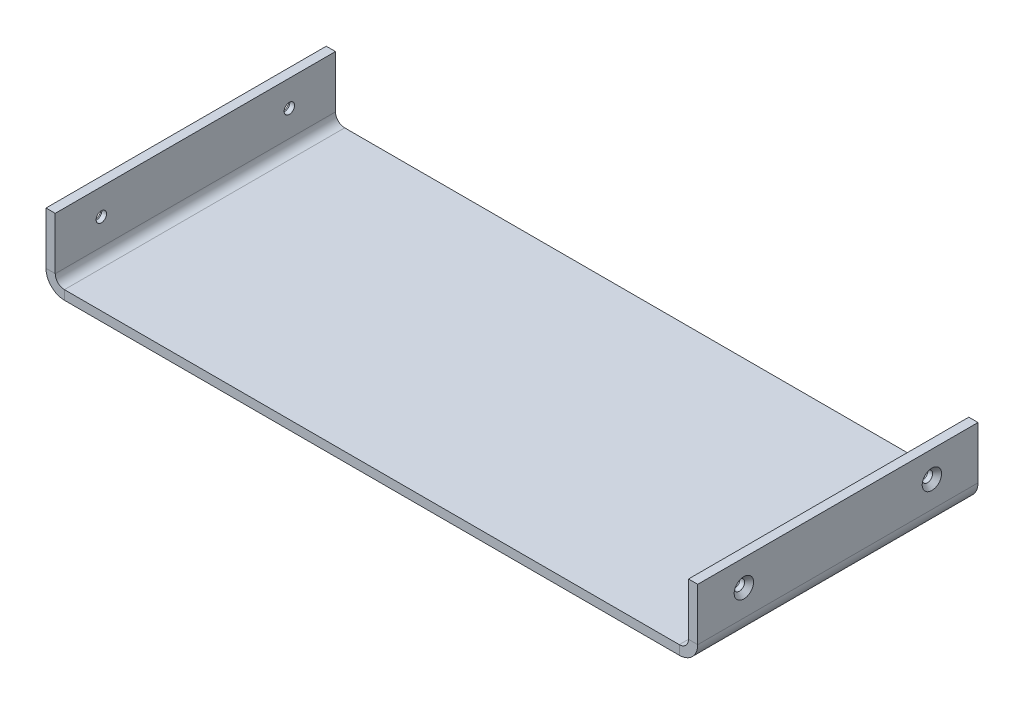
ISO-10303-21;
HEADER;
FILE_DESCRIPTION(('STEP AP214'),'2;1');
FILE_NAME('part.step','',(''),(''),'','','');
FILE_SCHEMA(('AUTOMOTIVE_DESIGN { 1 0 10303 214 1 1 1 1 }'));
ENDSEC;
DATA;
#1=APPLICATION_CONTEXT('core data for automotive mechanical design processes');
#2=APPLICATION_PROTOCOL_DEFINITION('international standard','automotive_design',2000,#1);
#3=PRODUCT_CONTEXT('',#1,'mechanical');
#4=PRODUCT('Part','Part','',(#3));
#5=PRODUCT_RELATED_PRODUCT_CATEGORY('part','',(#4));
#6=PRODUCT_DEFINITION_FORMATION('','',#4);
#7=PRODUCT_DEFINITION_CONTEXT('part definition',#1,'design');
#8=PRODUCT_DEFINITION('design','',#6,#7);
#9=PRODUCT_DEFINITION_SHAPE('','',#8);
#10=(LENGTH_UNIT() NAMED_UNIT(*) SI_UNIT(.MILLI.,.METRE.));
#11=(NAMED_UNIT(*) PLANE_ANGLE_UNIT() SI_UNIT($,.RADIAN.));
#12=(NAMED_UNIT(*) SI_UNIT($,.STERADIAN.) SOLID_ANGLE_UNIT());
#13=UNCERTAINTY_MEASURE_WITH_UNIT(LENGTH_MEASURE(1.E-05),#10,'distance_accuracy_value','');
#14=(GEOMETRIC_REPRESENTATION_CONTEXT(3) GLOBAL_UNCERTAINTY_ASSIGNED_CONTEXT((#13)) GLOBAL_UNIT_ASSIGNED_CONTEXT((#10,
#11,#12)) REPRESENTATION_CONTEXT('',''));
#15=CARTESIAN_POINT('',(0.,0.,0.));
#16=DIRECTION('',(0.,0.,1.));
#17=DIRECTION('',(1.,0.,0.));
#18=AXIS2_PLACEMENT_3D('',#15,#16,#17);
#19=CARTESIAN_POINT('',(100.,-3.,-45.58));
#20=DIRECTION('',(0.,0.,-1.));
#21=DIRECTION('',(-1.,0.,0.));
#22=AXIS2_PLACEMENT_3D('',#19,#20,#21);
#23=PLANE('',#22);
#24=DIRECTION('',(-1.,0.,0.));
#25=VECTOR('',#24,1.);
#26=CARTESIAN_POINT('',(100.,0.,-45.58));
#27=LINE('',#26,#25);
#28=CARTESIAN_POINT('',(100.,0.,-45.58));
#29=VERTEX_POINT('',#28);
#30=CARTESIAN_POINT('',(-100.,0.,-45.58));
#31=VERTEX_POINT('',#30);
#32=EDGE_CURVE('E118',#29,#31,#27,.T.);
#33=ORIENTED_EDGE('',*,*,#32,.F.);
#34=DIRECTION('',(0.,1.,0.));
#35=VECTOR('',#34,1.);
#36=CARTESIAN_POINT('',(100.,-3.,-45.58));
#37=LINE('',#36,#35);
#38=CARTESIAN_POINT('',(100.,-3.,-45.58));
#39=VERTEX_POINT('',#38);
#40=EDGE_CURVE('E86',#39,#29,#37,.T.);
#41=ORIENTED_EDGE('',*,*,#40,.F.);
#42=DIRECTION('',(-1.,0.,0.));
#43=VECTOR('',#42,1.);
#44=CARTESIAN_POINT('',(100.,-3.,-45.58));
#45=LINE('',#44,#43);
#46=CARTESIAN_POINT('',(-100.,-3.,-45.58));
#47=VERTEX_POINT('',#46);
#48=EDGE_CURVE('E120',#39,#47,#45,.T.);
#49=ORIENTED_EDGE('',*,*,#48,.T.);
#50=DIRECTION('',(0.,1.,0.));
#51=VECTOR('',#50,1.);
#52=CARTESIAN_POINT('',(-100.,-3.,-45.58));
#53=LINE('',#52,#51);
#54=EDGE_CURVE('E13',#47,#31,#53,.T.);
#55=ORIENTED_EDGE('',*,*,#54,.T.);
#56=EDGE_LOOP('',(#33,#41,#49,#55));
#57=FACE_BOUND('',#56,.T.);
#58=ADVANCED_FACE('F76',(#57),#23,.T.);
#59=CARTESIAN_POINT('',(100.,-3.,45.58));
#60=DIRECTION('',(0.,0.,1.));
#61=DIRECTION('',(1.,0.,0.));
#62=AXIS2_PLACEMENT_3D('',#59,#60,#61);
#63=PLANE('',#62);
#64=DIRECTION('',(1.,0.,0.));
#65=VECTOR('',#64,1.);
#66=CARTESIAN_POINT('',(100.,0.,45.58));
#67=LINE('',#66,#65);
#68=CARTESIAN_POINT('',(-100.,0.,45.58));
#69=VERTEX_POINT('',#68);
#70=CARTESIAN_POINT('',(100.,0.,45.58));
#71=VERTEX_POINT('',#70);
#72=EDGE_CURVE('E141',#69,#71,#67,.T.);
#73=ORIENTED_EDGE('',*,*,#72,.F.);
#74=DIRECTION('',(0.,1.,0.));
#75=VECTOR('',#74,1.);
#76=CARTESIAN_POINT('',(-100.,-3.,45.58));
#77=LINE('',#76,#75);
#78=CARTESIAN_POINT('',(-100.,-3.,45.58));
#79=VERTEX_POINT('',#78);
#80=EDGE_CURVE('E163',#79,#69,#77,.T.);
#81=ORIENTED_EDGE('',*,*,#80,.F.);
#82=DIRECTION('',(1.,0.,0.));
#83=VECTOR('',#82,1.);
#84=CARTESIAN_POINT('',(100.,-3.,45.58));
#85=LINE('',#84,#83);
#86=CARTESIAN_POINT('',(100.,-3.,45.58));
#87=VERTEX_POINT('',#86);
#88=EDGE_CURVE('E157',#79,#87,#85,.T.);
#89=ORIENTED_EDGE('',*,*,#88,.T.);
#90=DIRECTION('',(0.,1.,0.));
#91=VECTOR('',#90,1.);
#92=CARTESIAN_POINT('',(100.,-3.,45.58));
#93=LINE('',#92,#91);
#94=EDGE_CURVE('E168',#87,#71,#93,.T.);
#95=ORIENTED_EDGE('',*,*,#94,.T.);
#96=EDGE_LOOP('',(#73,#81,#89,#95));
#97=FACE_BOUND('',#96,.T.);
#98=ADVANCED_FACE('F78',(#97),#63,.T.);
#99=CARTESIAN_POINT('',(0.,-3.,0.));
#100=DIRECTION('',(0.,1.,0.));
#101=DIRECTION('',(0.,0.,1.));
#102=AXIS2_PLACEMENT_3D('',#99,#100,#101);
#103=PLANE('',#102);
#104=DIRECTION('',(0.,0.,1.));
#105=VECTOR('',#104,1.);
#106=CARTESIAN_POINT('',(-100.,-3.,45.58));
#107=LINE('',#106,#105);
#108=EDGE_CURVE('E95',#47,#79,#107,.T.);
#109=ORIENTED_EDGE('',*,*,#108,.F.);
#110=ORIENTED_EDGE('',*,*,#48,.F.);
#111=DIRECTION('',(0.,0.,-1.));
#112=VECTOR('',#111,1.);
#113=CARTESIAN_POINT('',(100.,-3.,45.58));
#114=LINE('',#113,#112);
#115=EDGE_CURVE('E160',#87,#39,#114,.T.);
#116=ORIENTED_EDGE('',*,*,#115,.F.);
#117=ORIENTED_EDGE('',*,*,#88,.F.);
#118=EDGE_LOOP('',(#109,#110,#116,#117));
#119=FACE_BOUND('',#118,.T.);
#120=ADVANCED_FACE('F323',(#119),#103,.F.);
#121=CARTESIAN_POINT('',(0.,0.,0.));
#122=DIRECTION('',(0.,1.,0.));
#123=DIRECTION('',(0.,0.,1.));
#124=AXIS2_PLACEMENT_3D('',#121,#122,#123);
#125=PLANE('',#124);
#126=DIRECTION('',(0.,0.,1.));
#127=VECTOR('',#126,1.);
#128=CARTESIAN_POINT('',(-100.,0.,45.58));
#129=LINE('',#128,#127);
#130=EDGE_CURVE('E128',#31,#69,#129,.T.);
#131=ORIENTED_EDGE('',*,*,#130,.T.);
#132=ORIENTED_EDGE('',*,*,#72,.T.);
#133=DIRECTION('',(0.,0.,-1.));
#134=VECTOR('',#133,1.);
#135=CARTESIAN_POINT('',(100.,0.,45.58));
#136=LINE('',#135,#134);
#137=EDGE_CURVE('E113',#71,#29,#136,.T.);
#138=ORIENTED_EDGE('',*,*,#137,.T.);
#139=ORIENTED_EDGE('',*,*,#32,.T.);
#140=EDGE_LOOP('',(#131,#132,#138,#139));
#141=FACE_BOUND('',#140,.T.);
#142=ADVANCED_FACE('F127',(#141),#125,.T.);
#143=CARTESIAN_POINT('',(-100.,3.,-45.58));
#144=DIRECTION('',(0.,0.,-1.));
#145=DIRECTION('',(-1.,0.,0.));
#146=AXIS2_PLACEMENT_3D('',#143,#144,#145);
#147=PLANE('',#146);
#148=DIRECTION('',(1.,0.,0.));
#149=VECTOR('',#148,1.);
#150=CARTESIAN_POINT('',(-106.,2.99999999999998,-45.58));
#151=LINE('',#150,#149);
#152=CARTESIAN_POINT('',(-103.,2.99999999999999,-45.58));
#153=VERTEX_POINT('',#152);
#154=CARTESIAN_POINT('',(-106.,2.99999999999998,-45.58));
#155=VERTEX_POINT('',#154);
#156=EDGE_CURVE('E147',#153,#155,#151,.F.);
#157=ORIENTED_EDGE('',*,*,#156,.F.);
#158=CARTESIAN_POINT('',(-100.,3.,-45.58));
#159=DIRECTION('',(0.,0.,1.));
#160=DIRECTION('',(1.,0.,0.));
#161=AXIS2_PLACEMENT_3D('',#158,#159,#160);
#162=CIRCLE('',#161,3.);
#163=EDGE_CURVE('E137',#31,#153,#162,.F.);
#164=ORIENTED_EDGE('',*,*,#163,.F.);
#165=ORIENTED_EDGE('',*,*,#54,.F.);
#166=CARTESIAN_POINT('',(-100.,3.,-45.58));
#167=DIRECTION('',(0.,0.,1.));
#168=DIRECTION('',(1.,0.,0.));
#169=AXIS2_PLACEMENT_3D('',#166,#167,#168);
#170=CIRCLE('',#169,6.);
#171=EDGE_CURVE('E142',#47,#155,#170,.F.);
#172=ORIENTED_EDGE('',*,*,#171,.T.);
#173=EDGE_LOOP('',(#157,#164,#165,#172));
#174=FACE_BOUND('',#173,.T.);
#175=ADVANCED_FACE('F145',(#174),#147,.T.);
#176=CARTESIAN_POINT('',(-100.,3.,45.58));
#177=DIRECTION('',(0.,0.,-1.));
#178=DIRECTION('',(-1.,0.,0.));
#179=AXIS2_PLACEMENT_3D('',#176,#177,#178);
#180=PLANE('',#179);
#181=CARTESIAN_POINT('',(-100.,3.,45.58));
#182=DIRECTION('',(0.,0.,1.));
#183=DIRECTION('',(1.,0.,0.));
#184=AXIS2_PLACEMENT_3D('',#181,#182,#183);
#185=CIRCLE('',#184,3.);
#186=CARTESIAN_POINT('',(-103.,2.99999999999999,45.58));
#187=VERTEX_POINT('',#186);
#188=EDGE_CURVE('E140',#187,#69,#185,.T.);
#189=ORIENTED_EDGE('',*,*,#188,.F.);
#190=DIRECTION('',(1.,0.,0.));
#191=VECTOR('',#190,1.);
#192=CARTESIAN_POINT('',(-103.,2.99999999999999,45.58));
#193=LINE('',#192,#191);
#194=CARTESIAN_POINT('',(-106.,2.99999999999998,45.58));
#195=VERTEX_POINT('',#194);
#196=EDGE_CURVE('E276',#187,#195,#193,.F.);
#197=ORIENTED_EDGE('',*,*,#196,.T.);
#198=CARTESIAN_POINT('',(-100.,3.,45.58));
#199=DIRECTION('',(0.,0.,1.));
#200=DIRECTION('',(1.,0.,0.));
#201=AXIS2_PLACEMENT_3D('',#198,#199,#200);
#202=CIRCLE('',#201,6.);
#203=EDGE_CURVE('E148',#195,#79,#202,.T.);
#204=ORIENTED_EDGE('',*,*,#203,.T.);
#205=ORIENTED_EDGE('',*,*,#80,.T.);
#206=EDGE_LOOP('',(#189,#197,#204,#205));
#207=FACE_BOUND('',#206,.T.);
#208=ADVANCED_FACE('F312',(#207),#180,.F.);
#209=CARTESIAN_POINT('',(-100.,3.,45.58));
#210=DIRECTION('',(0.,0.,1.));
#211=DIRECTION('',(-1.,0.,0.));
#212=AXIS2_PLACEMENT_3D('',#209,#210,#211);
#213=CYLINDRICAL_SURFACE('',#212,6.);
#214=ORIENTED_EDGE('',*,*,#108,.T.);
#215=ORIENTED_EDGE('',*,*,#203,.F.);
#216=DIRECTION('',(0.,0.,1.));
#217=VECTOR('',#216,1.);
#218=CARTESIAN_POINT('',(-106.,2.99999999999998,-45.58));
#219=LINE('',#218,#217);
#220=EDGE_CURVE('E273',#195,#155,#219,.F.);
#221=ORIENTED_EDGE('',*,*,#220,.T.);
#222=ORIENTED_EDGE('',*,*,#171,.F.);
#223=EDGE_LOOP('',(#214,#215,#221,#222));
#224=FACE_BOUND('',#223,.T.);
#225=ADVANCED_FACE('F326',(#224),#213,.T.);
#226=CARTESIAN_POINT('',(-100.,3.,45.58));
#227=DIRECTION('',(0.,0.,1.));
#228=DIRECTION('',(-1.,0.,0.));
#229=AXIS2_PLACEMENT_3D('',#226,#227,#228);
#230=CYLINDRICAL_SURFACE('',#229,3.);
#231=ORIENTED_EDGE('',*,*,#130,.F.);
#232=ORIENTED_EDGE('',*,*,#163,.T.);
#233=DIRECTION('',(0.,0.,1.));
#234=VECTOR('',#233,1.);
#235=CARTESIAN_POINT('',(-103.,2.99999999999999,-45.58));
#236=LINE('',#235,#234);
#237=EDGE_CURVE('E279',#153,#187,#236,.T.);
#238=ORIENTED_EDGE('',*,*,#237,.T.);
#239=ORIENTED_EDGE('',*,*,#188,.T.);
#240=EDGE_LOOP('',(#231,#232,#238,#239));
#241=FACE_BOUND('',#240,.T.);
#242=ADVANCED_FACE('F134',(#241),#230,.F.);
#243=CARTESIAN_POINT('',(-106.,20.,45.58));
#244=DIRECTION('',(0.,0.,-1.));
#245=DIRECTION('',(-1.,0.,0.));
#246=AXIS2_PLACEMENT_3D('',#243,#244,#245);
#247=PLANE('',#246);
#248=ORIENTED_EDGE('',*,*,#196,.F.);
#249=DIRECTION('',(0.,-1.,0.));
#250=VECTOR('',#249,1.);
#251=CARTESIAN_POINT('',(-103.,20.,45.58));
#252=LINE('',#251,#250);
#253=CARTESIAN_POINT('',(-103.,20.,45.58));
#254=VERTEX_POINT('',#253);
#255=EDGE_CURVE('E270',#187,#254,#252,.F.);
#256=ORIENTED_EDGE('',*,*,#255,.T.);
#257=DIRECTION('',(1.,0.,0.));
#258=VECTOR('',#257,1.);
#259=CARTESIAN_POINT('',(-106.,20.,45.58));
#260=LINE('',#259,#258);
#261=CARTESIAN_POINT('',(-106.,20.,45.58));
#262=VERTEX_POINT('',#261);
#263=EDGE_CURVE('E152',#262,#254,#260,.T.);
#264=ORIENTED_EDGE('',*,*,#263,.F.);
#265=DIRECTION('',(0.,1.,0.));
#266=VECTOR('',#265,1.);
#267=CARTESIAN_POINT('',(-106.,-3.57419139211891E-13,45.58));
#268=LINE('',#267,#266);
#269=EDGE_CURVE('E261',#195,#262,#268,.T.);
#270=ORIENTED_EDGE('',*,*,#269,.F.);
#271=EDGE_LOOP('',(#248,#256,#264,#270));
#272=FACE_BOUND('',#271,.T.);
#273=ADVANCED_FACE('F315',(#272),#247,.F.);
#274=CARTESIAN_POINT('',(-106.,0.,-45.58));
#275=DIRECTION('',(0.,0.,1.));
#276=DIRECTION('',(1.,0.,0.));
#277=AXIS2_PLACEMENT_3D('',#274,#275,#276);
#278=PLANE('',#277);
#279=ORIENTED_EDGE('',*,*,#156,.T.);
#280=DIRECTION('',(0.,-1.,0.));
#281=VECTOR('',#280,1.);
#282=CARTESIAN_POINT('',(-106.,-3.57419139211891E-13,-45.58));
#283=LINE('',#282,#281);
#284=CARTESIAN_POINT('',(-106.,20.,-45.58));
#285=VERTEX_POINT('',#284);
#286=EDGE_CURVE('E255',#285,#155,#283,.T.);
#287=ORIENTED_EDGE('',*,*,#286,.F.);
#288=DIRECTION('',(1.,0.,0.));
#289=VECTOR('',#288,1.);
#290=CARTESIAN_POINT('',(-106.,20.,-45.58));
#291=LINE('',#290,#289);
#292=CARTESIAN_POINT('',(-103.,20.,-45.58));
#293=VERTEX_POINT('',#292);
#294=EDGE_CURVE('E252',#285,#293,#291,.T.);
#295=ORIENTED_EDGE('',*,*,#294,.T.);
#296=DIRECTION('',(0.,1.,0.));
#297=VECTOR('',#296,1.);
#298=CARTESIAN_POINT('',(-103.,0.,-45.58));
#299=LINE('',#298,#297);
#300=EDGE_CURVE('E264',#293,#153,#299,.F.);
#301=ORIENTED_EDGE('',*,*,#300,.T.);
#302=EDGE_LOOP('',(#279,#287,#295,#301));
#303=FACE_BOUND('',#302,.T.);
#304=ADVANCED_FACE('F287',(#303),#278,.F.);
#305=CARTESIAN_POINT('',(-106.,-3.57419139211891E-13,0.));
#306=DIRECTION('',(1.,0.,0.));
#307=DIRECTION('',(0.,1.,0.));
#308=AXIS2_PLACEMENT_3D('',#305,#306,#307);
#309=PLANE('',#308);
#310=CARTESIAN_POINT('',(-106.,11.4999999999996,-30.58));
#311=DIRECTION('',(-1.,0.,0.));
#312=DIRECTION('',(0.,0.,1.));
#313=AXIS2_PLACEMENT_3D('',#310,#311,#312);
#314=CIRCLE('',#313,3.15);
#315=CARTESIAN_POINT('',(-106.,11.4999999999996,-27.43));
#316=VERTEX_POINT('',#315);
#317=EDGE_CURVE('E182',#316,#316,#314,.T.);
#318=ORIENTED_EDGE('',*,*,#317,.F.);
#319=EDGE_LOOP('',(#318));
#320=FACE_BOUND('',#319,.T.);
#321=CARTESIAN_POINT('',(-106.,11.5223220384594,30.5800166091226));
#322=DIRECTION('',(-1.,0.,0.));
#323=DIRECTION('',(0.,0.,1.));
#324=AXIS2_PLACEMENT_3D('',#321,#322,#323);
#325=CIRCLE('',#324,3.15);
#326=CARTESIAN_POINT('',(-106.,11.5223220384594,33.7300166091226));
#327=VERTEX_POINT('',#326);
#328=EDGE_CURVE('E178',#327,#327,#325,.T.);
#329=ORIENTED_EDGE('',*,*,#328,.F.);
#330=EDGE_LOOP('',(#329));
#331=FACE_BOUND('',#330,.T.);
#332=ORIENTED_EDGE('',*,*,#220,.F.);
#333=ORIENTED_EDGE('',*,*,#269,.T.);
#334=DIRECTION('',(0.,0.,-1.));
#335=VECTOR('',#334,1.);
#336=CARTESIAN_POINT('',(-106.,20.,0.));
#337=LINE('',#336,#335);
#338=EDGE_CURVE('E258',#262,#285,#337,.T.);
#339=ORIENTED_EDGE('',*,*,#338,.T.);
#340=ORIENTED_EDGE('',*,*,#286,.T.);
#341=EDGE_LOOP('',(#332,#333,#339,#340));
#342=FACE_BOUND('',#341,.T.);
#343=ADVANCED_FACE('F292',(#320,#331,#342),#309,.F.);
#344=CARTESIAN_POINT('',(-103.,-3.46944695195361E-13,0.));
#345=DIRECTION('',(1.,0.,0.));
#346=DIRECTION('',(0.,1.,0.));
#347=AXIS2_PLACEMENT_3D('',#344,#345,#346);
#348=PLANE('',#347);
#349=CARTESIAN_POINT('',(-103.,11.4999999999996,-30.58));
#350=DIRECTION('',(1.,0.,0.));
#351=DIRECTION('',(0.,1.,0.));
#352=AXIS2_PLACEMENT_3D('',#349,#350,#351);
#353=CIRCLE('',#352,1.69999999999999);
#354=CARTESIAN_POINT('',(-103.,13.1999999999996,-30.58));
#355=VERTEX_POINT('',#354);
#356=EDGE_CURVE('E176',#355,#355,#353,.T.);
#357=ORIENTED_EDGE('',*,*,#356,.F.);
#358=EDGE_LOOP('',(#357));
#359=FACE_BOUND('',#358,.T.);
#360=CARTESIAN_POINT('',(-103.,11.5223220384594,30.5800166091226));
#361=DIRECTION('',(1.,0.,0.));
#362=DIRECTION('',(0.,1.,0.));
#363=AXIS2_PLACEMENT_3D('',#360,#361,#362);
#364=CIRCLE('',#363,1.69999999999999);
#365=CARTESIAN_POINT('',(-103.,13.2223220384594,30.5800166091226));
#366=VERTEX_POINT('',#365);
#367=EDGE_CURVE('E171',#366,#366,#364,.T.);
#368=ORIENTED_EDGE('',*,*,#367,.F.);
#369=EDGE_LOOP('',(#368));
#370=FACE_BOUND('',#369,.T.);
#371=ORIENTED_EDGE('',*,*,#255,.F.);
#372=ORIENTED_EDGE('',*,*,#237,.F.);
#373=ORIENTED_EDGE('',*,*,#300,.F.);
#374=DIRECTION('',(0.,0.,1.));
#375=VECTOR('',#374,1.);
#376=CARTESIAN_POINT('',(-103.,20.,-45.58));
#377=LINE('',#376,#375);
#378=EDGE_CURVE('E267',#254,#293,#377,.F.);
#379=ORIENTED_EDGE('',*,*,#378,.F.);
#380=EDGE_LOOP('',(#371,#372,#373,#379));
#381=FACE_BOUND('',#380,.T.);
#382=ADVANCED_FACE('F308',(#359,#370,#381),#348,.T.);
#383=CARTESIAN_POINT('',(-106.,20.,-45.58));
#384=DIRECTION('',(0.,-1.,0.));
#385=DIRECTION('',(1.,0.,0.));
#386=AXIS2_PLACEMENT_3D('',#383,#384,#385);
#387=PLANE('',#386);
#388=ORIENTED_EDGE('',*,*,#378,.T.);
#389=ORIENTED_EDGE('',*,*,#294,.F.);
#390=ORIENTED_EDGE('',*,*,#338,.F.);
#391=ORIENTED_EDGE('',*,*,#263,.T.);
#392=EDGE_LOOP('',(#388,#389,#390,#391));
#393=FACE_BOUND('',#392,.T.);
#394=ADVANCED_FACE('F301',(#393),#387,.F.);
#395=CARTESIAN_POINT('',(100.,3.,45.58));
#396=DIRECTION('',(0.,0.,1.));
#397=DIRECTION('',(1.,0.,0.));
#398=AXIS2_PLACEMENT_3D('',#395,#396,#397);
#399=PLANE('',#398);
#400=DIRECTION('',(-1.,0.,0.));
#401=VECTOR('',#400,1.);
#402=CARTESIAN_POINT('',(106.,2.99999999999998,45.58));
#403=LINE('',#402,#401);
#404=CARTESIAN_POINT('',(103.,2.99999999999999,45.58));
#405=VERTEX_POINT('',#404);
#406=CARTESIAN_POINT('',(106.,2.99999999999998,45.58));
#407=VERTEX_POINT('',#406);
#408=EDGE_CURVE('E174',#405,#407,#403,.F.);
#409=ORIENTED_EDGE('',*,*,#408,.F.);
#410=CARTESIAN_POINT('',(100.,3.,45.58));
#411=DIRECTION('',(0.,0.,-1.));
#412=DIRECTION('',(-1.,0.,0.));
#413=AXIS2_PLACEMENT_3D('',#410,#411,#412);
#414=CIRCLE('',#413,3.);
#415=EDGE_CURVE('E245',#71,#405,#414,.F.);
#416=ORIENTED_EDGE('',*,*,#415,.F.);
#417=ORIENTED_EDGE('',*,*,#94,.F.);
#418=CARTESIAN_POINT('',(100.,3.,45.58));
#419=DIRECTION('',(0.,0.,-1.));
#420=DIRECTION('',(-1.,0.,0.));
#421=AXIS2_PLACEMENT_3D('',#418,#419,#420);
#422=CIRCLE('',#421,6.);
#423=EDGE_CURVE('E239',#87,#407,#422,.F.);
#424=ORIENTED_EDGE('',*,*,#423,.T.);
#425=EDGE_LOOP('',(#409,#416,#417,#424));
#426=FACE_BOUND('',#425,.T.);
#427=ADVANCED_FACE('F395',(#426),#399,.T.);
#428=CARTESIAN_POINT('',(100.,3.,-45.58));
#429=DIRECTION('',(0.,0.,1.));
#430=DIRECTION('',(1.,0.,0.));
#431=AXIS2_PLACEMENT_3D('',#428,#429,#430);
#432=PLANE('',#431);
#433=CARTESIAN_POINT('',(100.,3.,-45.58));
#434=DIRECTION('',(0.,0.,-1.));
#435=DIRECTION('',(-1.,0.,0.));
#436=AXIS2_PLACEMENT_3D('',#433,#434,#435);
#437=CIRCLE('',#436,3.);
#438=CARTESIAN_POINT('',(103.,2.99999999999999,-45.58));
#439=VERTEX_POINT('',#438);
#440=EDGE_CURVE('E206',#439,#29,#437,.T.);
#441=ORIENTED_EDGE('',*,*,#440,.F.);
#442=DIRECTION('',(-1.,0.,0.));
#443=VECTOR('',#442,1.);
#444=CARTESIAN_POINT('',(103.,2.99999999999999,-45.58));
#445=LINE('',#444,#443);
#446=CARTESIAN_POINT('',(106.,2.99999999999998,-45.58));
#447=VERTEX_POINT('',#446);
#448=EDGE_CURVE('E231',#439,#447,#445,.F.);
#449=ORIENTED_EDGE('',*,*,#448,.T.);
#450=CARTESIAN_POINT('',(100.,3.,-45.58));
#451=DIRECTION('',(0.,0.,-1.));
#452=DIRECTION('',(-1.,0.,0.));
#453=AXIS2_PLACEMENT_3D('',#450,#451,#452);
#454=CIRCLE('',#453,6.);
#455=EDGE_CURVE('E242',#447,#39,#454,.T.);
#456=ORIENTED_EDGE('',*,*,#455,.T.);
#457=ORIENTED_EDGE('',*,*,#40,.T.);
#458=EDGE_LOOP('',(#441,#449,#456,#457));
#459=FACE_BOUND('',#458,.T.);
#460=ADVANCED_FACE('F407',(#459),#432,.F.);
#461=CARTESIAN_POINT('',(100.,3.,-45.58));
#462=DIRECTION('',(0.,0.,-1.));
#463=DIRECTION('',(1.,0.,0.));
#464=AXIS2_PLACEMENT_3D('',#461,#462,#463);
#465=CYLINDRICAL_SURFACE('',#464,6.);
#466=ORIENTED_EDGE('',*,*,#115,.T.);
#467=ORIENTED_EDGE('',*,*,#455,.F.);
#468=DIRECTION('',(0.,0.,-1.));
#469=VECTOR('',#468,1.);
#470=CARTESIAN_POINT('',(106.,2.99999999999998,45.58));
#471=LINE('',#470,#469);
#472=EDGE_CURVE('E228',#447,#407,#471,.F.);
#473=ORIENTED_EDGE('',*,*,#472,.T.);
#474=ORIENTED_EDGE('',*,*,#423,.F.);
#475=EDGE_LOOP('',(#466,#467,#473,#474));
#476=FACE_BOUND('',#475,.T.);
#477=ADVANCED_FACE('F418',(#476),#465,.T.);
#478=CARTESIAN_POINT('',(100.,3.,-45.58));
#479=DIRECTION('',(0.,0.,-1.));
#480=DIRECTION('',(1.,0.,0.));
#481=AXIS2_PLACEMENT_3D('',#478,#479,#480);
#482=CYLINDRICAL_SURFACE('',#481,3.);
#483=ORIENTED_EDGE('',*,*,#137,.F.);
#484=ORIENTED_EDGE('',*,*,#415,.T.);
#485=DIRECTION('',(0.,0.,-1.));
#486=VECTOR('',#485,1.);
#487=CARTESIAN_POINT('',(103.,2.99999999999999,45.58));
#488=LINE('',#487,#486);
#489=EDGE_CURVE('E234',#405,#439,#488,.T.);
#490=ORIENTED_EDGE('',*,*,#489,.T.);
#491=ORIENTED_EDGE('',*,*,#440,.T.);
#492=EDGE_LOOP('',(#483,#484,#490,#491));
#493=FACE_BOUND('',#492,.T.);
#494=ADVANCED_FACE('F429',(#493),#482,.F.);
#495=CARTESIAN_POINT('',(106.,0.,45.58));
#496=DIRECTION('',(0.,0.,-1.));
#497=DIRECTION('',(0.,1.,0.));
#498=AXIS2_PLACEMENT_3D('',#495,#496,#497);
#499=PLANE('',#498);
#500=ORIENTED_EDGE('',*,*,#408,.T.);
#501=DIRECTION('',(0.,-1.,0.));
#502=VECTOR('',#501,1.);
#503=CARTESIAN_POINT('',(106.,-4.20674096039924E-13,45.58));
#504=LINE('',#503,#502);
#505=CARTESIAN_POINT('',(106.,19.9999999999993,45.58));
#506=VERTEX_POINT('',#505);
#507=EDGE_CURVE('E216',#506,#407,#504,.T.);
#508=ORIENTED_EDGE('',*,*,#507,.F.);
#509=DIRECTION('',(-1.,0.,0.));
#510=VECTOR('',#509,1.);
#511=CARTESIAN_POINT('',(106.,19.9999999999993,45.58));
#512=LINE('',#511,#510);
#513=CARTESIAN_POINT('',(103.,19.9999999999993,45.58));
#514=VERTEX_POINT('',#513);
#515=EDGE_CURVE('E207',#506,#514,#512,.T.);
#516=ORIENTED_EDGE('',*,*,#515,.T.);
#517=DIRECTION('',(0.,1.,0.));
#518=VECTOR('',#517,1.);
#519=CARTESIAN_POINT('',(103.,0.,45.58));
#520=LINE('',#519,#518);
#521=EDGE_CURVE('E225',#514,#405,#520,.F.);
#522=ORIENTED_EDGE('',*,*,#521,.T.);
#523=EDGE_LOOP('',(#500,#508,#516,#522));
#524=FACE_BOUND('',#523,.T.);
#525=ADVANCED_FACE('F440',(#524),#499,.F.);
#526=CARTESIAN_POINT('',(106.,19.9999999999993,-45.58));
#527=DIRECTION('',(0.,0.,1.));
#528=DIRECTION('',(0.,-1.,0.));
#529=AXIS2_PLACEMENT_3D('',#526,#527,#528);
#530=PLANE('',#529);
#531=ORIENTED_EDGE('',*,*,#448,.F.);
#532=DIRECTION('',(0.,-1.,0.));
#533=VECTOR('',#532,1.);
#534=CARTESIAN_POINT('',(103.,19.9999999999993,-45.58));
#535=LINE('',#534,#533);
#536=CARTESIAN_POINT('',(103.,19.9999999999993,-45.58));
#537=VERTEX_POINT('',#536);
#538=EDGE_CURVE('E222',#439,#537,#535,.F.);
#539=ORIENTED_EDGE('',*,*,#538,.T.);
#540=DIRECTION('',(-1.,0.,0.));
#541=VECTOR('',#540,1.);
#542=CARTESIAN_POINT('',(106.,19.9999999999993,-45.58));
#543=LINE('',#542,#541);
#544=CARTESIAN_POINT('',(106.,19.9999999999993,-45.58));
#545=VERTEX_POINT('',#544);
#546=EDGE_CURVE('E203',#545,#537,#543,.T.);
#547=ORIENTED_EDGE('',*,*,#546,.F.);
#548=DIRECTION('',(0.,1.,0.));
#549=VECTOR('',#548,1.);
#550=CARTESIAN_POINT('',(106.,-3.41605400004898E-13,-45.58));
#551=LINE('',#550,#549);
#552=EDGE_CURVE('E213',#447,#545,#551,.T.);
#553=ORIENTED_EDGE('',*,*,#552,.F.);
#554=EDGE_LOOP('',(#531,#539,#547,#553));
#555=FACE_BOUND('',#554,.T.);
#556=ADVANCED_FACE('F451',(#555),#530,.F.);
#557=CARTESIAN_POINT('',(106.,-3.57419139211903E-13,0.));
#558=DIRECTION('',(-1.,0.,0.));
#559=DIRECTION('',(0.,-1.,0.));
#560=AXIS2_PLACEMENT_3D('',#557,#558,#559);
#561=PLANE('',#560);
#562=CARTESIAN_POINT('',(106.,11.5223220384594,30.5800166091226));
#563=DIRECTION('',(1.,0.,0.));
#564=DIRECTION('',(0.,0.,-1.));
#565=AXIS2_PLACEMENT_3D('',#562,#563,#564);
#566=CIRCLE('',#565,3.15);
#567=CARTESIAN_POINT('',(106.,11.5223220384594,27.4300166091226));
#568=VERTEX_POINT('',#567);
#569=EDGE_CURVE('E601',#568,#568,#566,.T.);
#570=ORIENTED_EDGE('',*,*,#569,.F.);
#571=EDGE_LOOP('',(#570));
#572=FACE_BOUND('',#571,.T.);
#573=CARTESIAN_POINT('',(106.,11.4999999999996,-30.58));
#574=DIRECTION('',(1.,0.,0.));
#575=DIRECTION('',(0.,0.,-1.));
#576=AXIS2_PLACEMENT_3D('',#573,#574,#575);
#577=CIRCLE('',#576,3.15);
#578=CARTESIAN_POINT('',(106.,11.4999999999996,-33.73));
#579=VERTEX_POINT('',#578);
#580=EDGE_CURVE('E189',#579,#579,#577,.T.);
#581=ORIENTED_EDGE('',*,*,#580,.F.);
#582=EDGE_LOOP('',(#581));
#583=FACE_BOUND('',#582,.T.);
#584=ORIENTED_EDGE('',*,*,#472,.F.);
#585=ORIENTED_EDGE('',*,*,#552,.T.);
#586=DIRECTION('',(0.,0.,1.));
#587=VECTOR('',#586,1.);
#588=CARTESIAN_POINT('',(106.,19.9999999999993,0.));
#589=LINE('',#588,#587);
#590=EDGE_CURVE('E210',#545,#506,#589,.T.);
#591=ORIENTED_EDGE('',*,*,#590,.T.);
#592=ORIENTED_EDGE('',*,*,#507,.T.);
#593=EDGE_LOOP('',(#584,#585,#591,#592));
#594=FACE_BOUND('',#593,.T.);
#595=ADVANCED_FACE('F462',(#572,#583,#594),#561,.F.);
#596=CARTESIAN_POINT('',(103.,-3.46944695195374E-13,0.));
#597=DIRECTION('',(-1.,0.,0.));
#598=DIRECTION('',(0.,-1.,0.));
#599=AXIS2_PLACEMENT_3D('',#596,#597,#598);
#600=PLANE('',#599);
#601=CARTESIAN_POINT('',(103.,11.5223220384594,30.5800166091226));
#602=DIRECTION('',(-1.,0.,0.));
#603=DIRECTION('',(0.,-1.,0.));
#604=AXIS2_PLACEMENT_3D('',#601,#602,#603);
#605=CIRCLE('',#604,1.69999999999999);
#606=CARTESIAN_POINT('',(103.,9.82232203845941,30.5800166091226));
#607=VERTEX_POINT('',#606);
#608=EDGE_CURVE('E80',#607,#607,#605,.T.);
#609=ORIENTED_EDGE('',*,*,#608,.F.);
#610=EDGE_LOOP('',(#609));
#611=FACE_BOUND('',#610,.T.);
#612=CARTESIAN_POINT('',(103.,11.4999999999996,-30.58));
#613=DIRECTION('',(-1.,0.,0.));
#614=DIRECTION('',(0.,-1.,0.));
#615=AXIS2_PLACEMENT_3D('',#612,#613,#614);
#616=CIRCLE('',#615,1.69999999999999);
#617=CARTESIAN_POINT('',(103.,9.79999999999964,-30.58));
#618=VERTEX_POINT('',#617);
#619=EDGE_CURVE('E180',#618,#618,#616,.T.);
#620=ORIENTED_EDGE('',*,*,#619,.F.);
#621=EDGE_LOOP('',(#620));
#622=FACE_BOUND('',#621,.T.);
#623=ORIENTED_EDGE('',*,*,#538,.F.);
#624=ORIENTED_EDGE('',*,*,#489,.F.);
#625=ORIENTED_EDGE('',*,*,#521,.F.);
#626=DIRECTION('',(0.,0.,-1.));
#627=VECTOR('',#626,1.);
#628=CARTESIAN_POINT('',(103.,19.9999999999993,45.58));
#629=LINE('',#628,#627);
#630=EDGE_CURVE('E219',#537,#514,#629,.F.);
#631=ORIENTED_EDGE('',*,*,#630,.F.);
#632=EDGE_LOOP('',(#623,#624,#625,#631));
#633=FACE_BOUND('',#632,.T.);
#634=ADVANCED_FACE('F477',(#611,#622,#633),#600,.T.);
#635=CARTESIAN_POINT('',(106.,19.9999999999993,45.58));
#636=DIRECTION('',(0.,-1.,0.));
#637=DIRECTION('',(1.,0.,0.));
#638=AXIS2_PLACEMENT_3D('',#635,#636,#637);
#639=PLANE('',#638);
#640=ORIENTED_EDGE('',*,*,#630,.T.);
#641=ORIENTED_EDGE('',*,*,#515,.F.);
#642=ORIENTED_EDGE('',*,*,#590,.F.);
#643=ORIENTED_EDGE('',*,*,#546,.T.);
#644=EDGE_LOOP('',(#640,#641,#642,#643));
#645=FACE_BOUND('',#644,.T.);
#646=ADVANCED_FACE('F471',(#645),#639,.F.);
#647=CARTESIAN_POINT('',(-106.,11.5223220384594,30.5800166091226));
#648=DIRECTION('',(-1.,0.,0.));
#649=DIRECTION('',(0.,0.,1.));
#650=AXIS2_PLACEMENT_3D('',#647,#648,#649);
#651=CYLINDRICAL_SURFACE('',#650,1.69999999999999);
#652=ORIENTED_EDGE('',*,*,#367,.T.);
#653=EDGE_LOOP('',(#652));
#654=FACE_BOUND('',#653,.T.);
#655=CARTESIAN_POINT('',(-104.55,11.5223220384594,30.5800166091226));
#656=DIRECTION('',(-1.,0.,0.));
#657=DIRECTION('',(0.,0.,1.));
#658=AXIS2_PLACEMENT_3D('',#655,#656,#657);
#659=CIRCLE('',#658,1.7);
#660=CARTESIAN_POINT('',(-104.55,11.5223220384594,32.2800166091226));
#661=VERTEX_POINT('',#660);
#662=EDGE_CURVE('E175',#661,#661,#659,.T.);
#663=ORIENTED_EDGE('',*,*,#662,.T.);
#664=EDGE_LOOP('',(#663));
#665=FACE_BOUND('',#664,.T.);
#666=ADVANCED_FACE('F476',(#654,#665),#651,.F.);
#667=CARTESIAN_POINT('',(-106.,11.5223220384594,30.5800166091226));
#668=DIRECTION('',(-1.,0.,0.));
#669=DIRECTION('',(0.,0.,1.));
#670=AXIS2_PLACEMENT_3D('',#667,#668,#669);
#671=CONICAL_SURFACE('',#670,3.15,0.785398163397447);
#672=ORIENTED_EDGE('',*,*,#662,.F.);
#673=EDGE_LOOP('',(#672));
#674=FACE_BOUND('',#673,.T.);
#675=ORIENTED_EDGE('',*,*,#328,.T.);
#676=EDGE_LOOP('',(#675));
#677=FACE_BOUND('',#676,.T.);
#678=ADVANCED_FACE('F522',(#674,#677),#671,.F.);
#679=CARTESIAN_POINT('',(-106.,11.4999999999996,-30.58));
#680=DIRECTION('',(-1.,0.,0.));
#681=DIRECTION('',(0.,0.,1.));
#682=AXIS2_PLACEMENT_3D('',#679,#680,#681);
#683=CYLINDRICAL_SURFACE('',#682,1.69999999999999);
#684=ORIENTED_EDGE('',*,*,#356,.T.);
#685=EDGE_LOOP('',(#684));
#686=FACE_BOUND('',#685,.T.);
#687=CARTESIAN_POINT('',(-104.55,11.4999999999996,-30.58));
#688=DIRECTION('',(-1.,0.,0.));
#689=DIRECTION('',(0.,0.,1.));
#690=AXIS2_PLACEMENT_3D('',#687,#688,#689);
#691=CIRCLE('',#690,1.7);
#692=CARTESIAN_POINT('',(-104.55,11.4999999999996,-28.88));
#693=VERTEX_POINT('',#692);
#694=EDGE_CURVE('E179',#693,#693,#691,.T.);
#695=ORIENTED_EDGE('',*,*,#694,.T.);
#696=EDGE_LOOP('',(#695));
#697=FACE_BOUND('',#696,.T.);
#698=ADVANCED_FACE('F532',(#686,#697),#683,.F.);
#699=CARTESIAN_POINT('',(-106.,11.4999999999996,-30.58));
#700=DIRECTION('',(-1.,0.,0.));
#701=DIRECTION('',(0.,0.,1.));
#702=AXIS2_PLACEMENT_3D('',#699,#700,#701);
#703=CONICAL_SURFACE('',#702,3.15,0.785398163397447);
#704=ORIENTED_EDGE('',*,*,#694,.F.);
#705=EDGE_LOOP('',(#704));
#706=FACE_BOUND('',#705,.T.);
#707=ORIENTED_EDGE('',*,*,#317,.T.);
#708=EDGE_LOOP('',(#707));
#709=FACE_BOUND('',#708,.T.);
#710=ADVANCED_FACE('F542',(#706,#709),#703,.F.);
#711=CARTESIAN_POINT('',(106.,11.4999999999996,-30.58));
#712=DIRECTION('',(1.,0.,0.));
#713=DIRECTION('',(0.,0.,-1.));
#714=AXIS2_PLACEMENT_3D('',#711,#712,#713);
#715=CYLINDRICAL_SURFACE('',#714,1.69999999999999);
#716=ORIENTED_EDGE('',*,*,#619,.T.);
#717=EDGE_LOOP('',(#716));
#718=FACE_BOUND('',#717,.T.);
#719=CARTESIAN_POINT('',(104.55,11.4999999999996,-30.58));
#720=DIRECTION('',(1.,0.,0.));
#721=DIRECTION('',(0.,0.,-1.));
#722=AXIS2_PLACEMENT_3D('',#719,#720,#721);
#723=CIRCLE('',#722,1.7);
#724=CARTESIAN_POINT('',(104.55,11.4999999999996,-32.28));
#725=VERTEX_POINT('',#724);
#726=EDGE_CURVE('E183',#725,#725,#723,.T.);
#727=ORIENTED_EDGE('',*,*,#726,.T.);
#728=EDGE_LOOP('',(#727));
#729=FACE_BOUND('',#728,.T.);
#730=ADVANCED_FACE('F552',(#718,#729),#715,.F.);
#731=CARTESIAN_POINT('',(106.,11.4999999999996,-30.58));
#732=DIRECTION('',(1.,0.,0.));
#733=DIRECTION('',(0.,0.,-1.));
#734=AXIS2_PLACEMENT_3D('',#731,#732,#733);
#735=CONICAL_SURFACE('',#734,3.15,0.785398163397447);
#736=ORIENTED_EDGE('',*,*,#726,.F.);
#737=EDGE_LOOP('',(#736));
#738=FACE_BOUND('',#737,.T.);
#739=ORIENTED_EDGE('',*,*,#580,.T.);
#740=EDGE_LOOP('',(#739));
#741=FACE_BOUND('',#740,.T.);
#742=ADVANCED_FACE('F562',(#738,#741),#735,.F.);
#743=CARTESIAN_POINT('',(106.,11.5223220384594,30.5800166091226));
#744=DIRECTION('',(1.,0.,0.));
#745=DIRECTION('',(0.,0.,-1.));
#746=AXIS2_PLACEMENT_3D('',#743,#744,#745);
#747=CYLINDRICAL_SURFACE('',#746,1.69999999999999);
#748=ORIENTED_EDGE('',*,*,#608,.T.);
#749=EDGE_LOOP('',(#748));
#750=FACE_BOUND('',#749,.T.);
#751=CARTESIAN_POINT('',(104.55,11.5223220384594,30.5800166091226));
#752=DIRECTION('',(1.,0.,0.));
#753=DIRECTION('',(0.,0.,-1.));
#754=AXIS2_PLACEMENT_3D('',#751,#752,#753);
#755=CIRCLE('',#754,1.7);
#756=CARTESIAN_POINT('',(104.55,11.5223220384594,28.8800166091226));
#757=VERTEX_POINT('',#756);
#758=EDGE_CURVE('E598',#757,#757,#755,.T.);
#759=ORIENTED_EDGE('',*,*,#758,.T.);
#760=EDGE_LOOP('',(#759));
#761=FACE_BOUND('',#760,.T.);
#762=ADVANCED_FACE('F571',(#750,#761),#747,.F.);
#763=CARTESIAN_POINT('',(106.,11.5223220384594,30.5800166091226));
#764=DIRECTION('',(1.,0.,0.));
#765=DIRECTION('',(0.,0.,-1.));
#766=AXIS2_PLACEMENT_3D('',#763,#764,#765);
#767=CONICAL_SURFACE('',#766,3.15,0.785398163397447);
#768=ORIENTED_EDGE('',*,*,#758,.F.);
#769=EDGE_LOOP('',(#768));
#770=FACE_BOUND('',#769,.T.);
#771=ORIENTED_EDGE('',*,*,#569,.T.);
#772=EDGE_LOOP('',(#771));
#773=FACE_BOUND('',#772,.T.);
#774=ADVANCED_FACE('F581',(#770,#773),#767,.F.);
#775=CLOSED_SHELL('',(#58,#98,#120,#142,#175,#208,#225,#242,#273,#304,#343,#382,#394,#427,#460,
#477,#494,#525,#556,#595,#634,#646,#666,#678,#698,#710,#730,#742,#762,#774));
#776=MANIFOLD_SOLID_BREP('B2',#775);
#777=ADVANCED_BREP_SHAPE_REPRESENTATION('',(#18,#776),#14);
#778=SHAPE_DEFINITION_REPRESENTATION(#9,#777);
ENDSEC;
END-ISO-10303-21;
